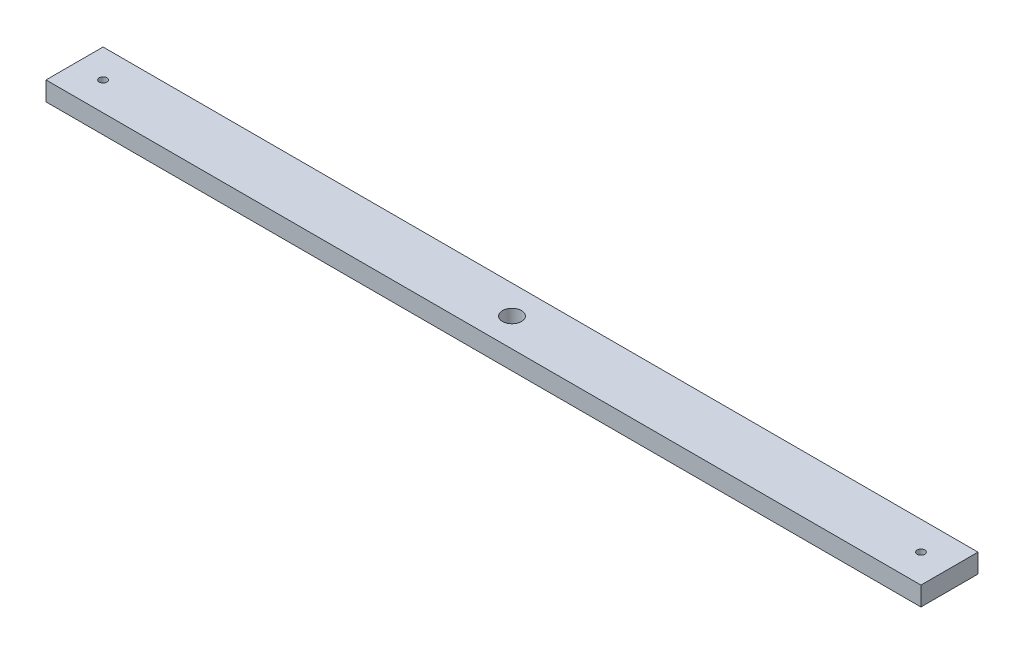
ISO-10303-21;
HEADER;
FILE_DESCRIPTION(('STEP AP214'),'2;1');
FILE_NAME('part.step','',(''),(''),'','','');
FILE_SCHEMA(('AUTOMOTIVE_DESIGN { 1 0 10303 214 1 1 1 1 }'));
ENDSEC;
DATA;
#1=APPLICATION_CONTEXT('core data for automotive mechanical design processes');
#2=APPLICATION_PROTOCOL_DEFINITION('international standard','automotive_design',2000,#1);
#3=PRODUCT_CONTEXT('',#1,'mechanical');
#4=PRODUCT('Part','Part','',(#3));
#5=PRODUCT_RELATED_PRODUCT_CATEGORY('part','',(#4));
#6=PRODUCT_DEFINITION_FORMATION('','',#4);
#7=PRODUCT_DEFINITION_CONTEXT('part definition',#1,'design');
#8=PRODUCT_DEFINITION('design','',#6,#7);
#9=PRODUCT_DEFINITION_SHAPE('','',#8);
#10=(LENGTH_UNIT() NAMED_UNIT(*) SI_UNIT(.MILLI.,.METRE.));
#11=(NAMED_UNIT(*) PLANE_ANGLE_UNIT() SI_UNIT($,.RADIAN.));
#12=(NAMED_UNIT(*) SI_UNIT($,.STERADIAN.) SOLID_ANGLE_UNIT());
#13=UNCERTAINTY_MEASURE_WITH_UNIT(LENGTH_MEASURE(1.E-05),#10,'distance_accuracy_value','');
#14=(GEOMETRIC_REPRESENTATION_CONTEXT(3) GLOBAL_UNCERTAINTY_ASSIGNED_CONTEXT((#13)) GLOBAL_UNIT_ASSIGNED_CONTEXT((#10,
#11,#12)) REPRESENTATION_CONTEXT('',''));
#15=CARTESIAN_POINT('',(0.,0.,0.));
#16=DIRECTION('',(0.,0.,1.));
#17=DIRECTION('',(1.,0.,0.));
#18=AXIS2_PLACEMENT_3D('',#15,#16,#17);
#19=CARTESIAN_POINT('',(292.1,-6.35,-19.05));
#20=DIRECTION('',(0.,0.,1.));
#21=DIRECTION('',(1.,0.,0.));
#22=AXIS2_PLACEMENT_3D('',#19,#20,#21);
#23=PLANE('',#22);
#24=DIRECTION('',(0.,1.,0.));
#25=VECTOR('',#24,1.);
#26=CARTESIAN_POINT('',(-292.1,-6.35,-19.05));
#27=LINE('',#26,#25);
#28=CARTESIAN_POINT('',(-292.1,-6.35,-19.05));
#29=VERTEX_POINT('',#28);
#30=CARTESIAN_POINT('',(-292.1,6.35,-19.05));
#31=VERTEX_POINT('',#30);
#32=EDGE_CURVE('E96',#29,#31,#27,.T.);
#33=ORIENTED_EDGE('',*,*,#32,.T.);
#34=DIRECTION('',(-1.,0.,0.));
#35=VECTOR('',#34,1.);
#36=CARTESIAN_POINT('',(292.1,6.35,-19.05));
#37=LINE('',#36,#35);
#38=CARTESIAN_POINT('',(292.1,6.35,-19.05));
#39=VERTEX_POINT('',#38);
#40=EDGE_CURVE('E11',#39,#31,#37,.T.);
#41=ORIENTED_EDGE('',*,*,#40,.F.);
#42=DIRECTION('',(0.,1.,0.));
#43=VECTOR('',#42,1.);
#44=CARTESIAN_POINT('',(292.1,-6.35,-19.05));
#45=LINE('',#44,#43);
#46=CARTESIAN_POINT('',(292.1,-6.35,-19.05));
#47=VERTEX_POINT('',#46);
#48=EDGE_CURVE('E84',#47,#39,#45,.T.);
#49=ORIENTED_EDGE('',*,*,#48,.F.);
#50=DIRECTION('',(-1.,0.,0.));
#51=VECTOR('',#50,1.);
#52=CARTESIAN_POINT('',(292.1,-6.35,-19.05));
#53=LINE('',#52,#51);
#54=EDGE_CURVE('E92',#47,#29,#53,.T.);
#55=ORIENTED_EDGE('',*,*,#54,.T.);
#56=EDGE_LOOP('',(#33,#41,#49,#55));
#57=FACE_BOUND('',#56,.T.);
#58=ADVANCED_FACE('F33',(#57),#23,.F.);
#59=CARTESIAN_POINT('',(292.1,6.35,19.05));
#60=DIRECTION('',(0.,-1.,0.));
#61=DIRECTION('',(0.,0.,-1.));
#62=AXIS2_PLACEMENT_3D('',#59,#60,#61);
#63=PLANE('',#62);
#64=CARTESIAN_POINT('',(-273.05,6.35,0.));
#65=DIRECTION('',(0.,-1.,0.));
#66=DIRECTION('',(0.,0.,-1.));
#67=AXIS2_PLACEMENT_3D('',#64,#65,#66);
#68=CIRCLE('',#67,2.55270000000002);
#69=CARTESIAN_POINT('',(-273.05,6.35,-2.55270000000002));
#70=VERTEX_POINT('',#69);
#71=EDGE_CURVE('E121',#70,#70,#68,.T.);
#72=ORIENTED_EDGE('',*,*,#71,.T.);
#73=EDGE_LOOP('',(#72));
#74=FACE_BOUND('',#73,.T.);
#75=CARTESIAN_POINT('',(273.05,6.35,0.));
#76=DIRECTION('',(0.,-1.,0.));
#77=DIRECTION('',(0.,0.,-1.));
#78=AXIS2_PLACEMENT_3D('',#75,#76,#77);
#79=CIRCLE('',#78,2.55270000000002);
#80=CARTESIAN_POINT('',(273.05,6.35,-2.55270000000002));
#81=VERTEX_POINT('',#80);
#82=EDGE_CURVE('E113',#81,#81,#79,.T.);
#83=ORIENTED_EDGE('',*,*,#82,.T.);
#84=EDGE_LOOP('',(#83));
#85=FACE_BOUND('',#84,.T.);
#86=CARTESIAN_POINT('',(0.,6.35,0.));
#87=DIRECTION('',(0.,1.,0.));
#88=DIRECTION('',(0.,0.,1.));
#89=AXIS2_PLACEMENT_3D('',#86,#87,#88);
#90=CIRCLE('',#89,6.35);
#91=CARTESIAN_POINT('',(0.,6.35,6.35));
#92=VERTEX_POINT('',#91);
#93=EDGE_CURVE('E110',#92,#92,#90,.T.);
#94=ORIENTED_EDGE('',*,*,#93,.F.);
#95=EDGE_LOOP('',(#94));
#96=FACE_BOUND('',#95,.T.);
#97=DIRECTION('',(0.,0.,1.));
#98=VECTOR('',#97,1.);
#99=CARTESIAN_POINT('',(-292.1,6.35,19.05));
#100=LINE('',#99,#98);
#101=CARTESIAN_POINT('',(-292.1,6.35,19.05));
#102=VERTEX_POINT('',#101);
#103=EDGE_CURVE('E88',#31,#102,#100,.T.);
#104=ORIENTED_EDGE('',*,*,#103,.T.);
#105=DIRECTION('',(-1.,0.,0.));
#106=VECTOR('',#105,1.);
#107=CARTESIAN_POINT('',(292.1,6.35,19.05));
#108=LINE('',#107,#106);
#109=CARTESIAN_POINT('',(292.1,6.35,19.05));
#110=VERTEX_POINT('',#109);
#111=EDGE_CURVE('E41',#110,#102,#108,.T.);
#112=ORIENTED_EDGE('',*,*,#111,.F.);
#113=DIRECTION('',(0.,0.,1.));
#114=VECTOR('',#113,1.);
#115=CARTESIAN_POINT('',(292.1,6.35,19.05));
#116=LINE('',#115,#114);
#117=EDGE_CURVE('E79',#39,#110,#116,.T.);
#118=ORIENTED_EDGE('',*,*,#117,.F.);
#119=ORIENTED_EDGE('',*,*,#40,.T.);
#120=EDGE_LOOP('',(#104,#112,#118,#119));
#121=FACE_BOUND('',#120,.T.);
#122=ADVANCED_FACE('F87',(#74,#85,#96,#121),#63,.F.);
#123=CARTESIAN_POINT('',(292.1,-6.35,19.05));
#124=DIRECTION('',(0.,0.,-1.));
#125=DIRECTION('',(-1.,0.,0.));
#126=AXIS2_PLACEMENT_3D('',#123,#124,#125);
#127=PLANE('',#126);
#128=DIRECTION('',(0.,-1.,0.));
#129=VECTOR('',#128,1.);
#130=CARTESIAN_POINT('',(-292.1,-6.35,19.05));
#131=LINE('',#130,#129);
#132=CARTESIAN_POINT('',(-292.1,-6.35,19.05));
#133=VERTEX_POINT('',#132);
#134=EDGE_CURVE('E66',#102,#133,#131,.T.);
#135=ORIENTED_EDGE('',*,*,#134,.T.);
#136=DIRECTION('',(-1.,0.,0.));
#137=VECTOR('',#136,1.);
#138=CARTESIAN_POINT('',(292.1,-6.35,19.05));
#139=LINE('',#138,#137);
#140=CARTESIAN_POINT('',(292.1,-6.35,19.05));
#141=VERTEX_POINT('',#140);
#142=EDGE_CURVE('E89',#141,#133,#139,.T.);
#143=ORIENTED_EDGE('',*,*,#142,.F.);
#144=DIRECTION('',(0.,-1.,0.));
#145=VECTOR('',#144,1.);
#146=CARTESIAN_POINT('',(292.1,-6.35,19.05));
#147=LINE('',#146,#145);
#148=EDGE_CURVE('E82',#110,#141,#147,.T.);
#149=ORIENTED_EDGE('',*,*,#148,.F.);
#150=ORIENTED_EDGE('',*,*,#111,.T.);
#151=EDGE_LOOP('',(#135,#143,#149,#150));
#152=FACE_BOUND('',#151,.T.);
#153=ADVANCED_FACE('F90',(#152),#127,.F.);
#154=CARTESIAN_POINT('',(292.1,-6.35,19.05));
#155=DIRECTION('',(0.,1.,0.));
#156=DIRECTION('',(0.,0.,1.));
#157=AXIS2_PLACEMENT_3D('',#154,#155,#156);
#158=PLANE('',#157);
#159=CARTESIAN_POINT('',(-273.05,-6.35,0.));
#160=DIRECTION('',(0.,-1.,0.));
#161=DIRECTION('',(0.,0.,-1.));
#162=AXIS2_PLACEMENT_3D('',#159,#160,#161);
#163=CIRCLE('',#162,2.55269999999996);
#164=CARTESIAN_POINT('',(-273.05,-6.35,-2.55269999999996));
#165=VERTEX_POINT('',#164);
#166=EDGE_CURVE('E124',#165,#165,#163,.T.);
#167=ORIENTED_EDGE('',*,*,#166,.F.);
#168=EDGE_LOOP('',(#167));
#169=FACE_BOUND('',#168,.T.);
#170=CARTESIAN_POINT('',(273.05,-6.35,0.));
#171=DIRECTION('',(0.,-1.,0.));
#172=DIRECTION('',(0.,0.,-1.));
#173=AXIS2_PLACEMENT_3D('',#170,#171,#172);
#174=CIRCLE('',#173,2.55269999999996);
#175=CARTESIAN_POINT('',(273.05,-6.35,-2.55269999999996));
#176=VERTEX_POINT('',#175);
#177=EDGE_CURVE('E118',#176,#176,#174,.T.);
#178=ORIENTED_EDGE('',*,*,#177,.F.);
#179=EDGE_LOOP('',(#178));
#180=FACE_BOUND('',#179,.T.);
#181=CARTESIAN_POINT('',(0.,-6.35,0.));
#182=DIRECTION('',(0.,1.,0.));
#183=DIRECTION('',(0.,0.,1.));
#184=AXIS2_PLACEMENT_3D('',#181,#182,#183);
#185=CIRCLE('',#184,6.35);
#186=CARTESIAN_POINT('',(0.,-6.35,6.35));
#187=VERTEX_POINT('',#186);
#188=EDGE_CURVE('E99',#187,#187,#185,.T.);
#189=ORIENTED_EDGE('',*,*,#188,.T.);
#190=EDGE_LOOP('',(#189));
#191=FACE_BOUND('',#190,.T.);
#192=DIRECTION('',(0.,0.,-1.));
#193=VECTOR('',#192,1.);
#194=CARTESIAN_POINT('',(-292.1,-6.35,19.05));
#195=LINE('',#194,#193);
#196=EDGE_CURVE('E72',#133,#29,#195,.T.);
#197=ORIENTED_EDGE('',*,*,#196,.T.);
#198=ORIENTED_EDGE('',*,*,#54,.F.);
#199=DIRECTION('',(0.,0.,-1.));
#200=VECTOR('',#199,1.);
#201=CARTESIAN_POINT('',(292.1,-6.35,19.05));
#202=LINE('',#201,#200);
#203=EDGE_CURVE('E49',#141,#47,#202,.T.);
#204=ORIENTED_EDGE('',*,*,#203,.F.);
#205=ORIENTED_EDGE('',*,*,#142,.T.);
#206=EDGE_LOOP('',(#197,#198,#204,#205));
#207=FACE_BOUND('',#206,.T.);
#208=ADVANCED_FACE('F104',(#169,#180,#191,#207),#158,.F.);
#209=CARTESIAN_POINT('',(292.1,0.,0.));
#210=DIRECTION('',(-1.,0.,0.));
#211=DIRECTION('',(0.,0.,1.));
#212=AXIS2_PLACEMENT_3D('',#209,#210,#211);
#213=PLANE('',#212);
#214=ORIENTED_EDGE('',*,*,#48,.T.);
#215=ORIENTED_EDGE('',*,*,#117,.T.);
#216=ORIENTED_EDGE('',*,*,#148,.T.);
#217=ORIENTED_EDGE('',*,*,#203,.T.);
#218=EDGE_LOOP('',(#214,#215,#216,#217));
#219=FACE_BOUND('',#218,.T.);
#220=ADVANCED_FACE('F80',(#219),#213,.F.);
#221=CARTESIAN_POINT('',(-292.1,0.,0.));
#222=DIRECTION('',(-1.,0.,0.));
#223=DIRECTION('',(0.,0.,1.));
#224=AXIS2_PLACEMENT_3D('',#221,#222,#223);
#225=PLANE('',#224);
#226=ORIENTED_EDGE('',*,*,#32,.F.);
#227=ORIENTED_EDGE('',*,*,#196,.F.);
#228=ORIENTED_EDGE('',*,*,#134,.F.);
#229=ORIENTED_EDGE('',*,*,#103,.F.);
#230=EDGE_LOOP('',(#226,#227,#228,#229));
#231=FACE_BOUND('',#230,.T.);
#232=ADVANCED_FACE('F107',(#231),#225,.T.);
#233=CARTESIAN_POINT('',(0.,-6.35,0.));
#234=DIRECTION('',(0.,1.,0.));
#235=DIRECTION('',(0.,0.,1.));
#236=AXIS2_PLACEMENT_3D('',#233,#234,#235);
#237=CYLINDRICAL_SURFACE('',#236,6.35);
#238=ORIENTED_EDGE('',*,*,#188,.F.);
#239=EDGE_LOOP('',(#238));
#240=FACE_BOUND('',#239,.T.);
#241=ORIENTED_EDGE('',*,*,#93,.T.);
#242=EDGE_LOOP('',(#241));
#243=FACE_BOUND('',#242,.T.);
#244=ADVANCED_FACE('F137',(#240,#243),#237,.F.);
#245=CARTESIAN_POINT('',(273.05,-6.35,0.));
#246=DIRECTION('',(0.,-1.,0.));
#247=DIRECTION('',(0.,0.,-1.));
#248=AXIS2_PLACEMENT_3D('',#245,#246,#247);
#249=CYLINDRICAL_SURFACE('',#248,2.55269999999999);
#250=ORIENTED_EDGE('',*,*,#82,.F.);
#251=EDGE_LOOP('',(#250));
#252=FACE_BOUND('',#251,.T.);
#253=ORIENTED_EDGE('',*,*,#177,.T.);
#254=EDGE_LOOP('',(#253));
#255=FACE_BOUND('',#254,.T.);
#256=ADVANCED_FACE('F140',(#252,#255),#249,.F.);
#257=CARTESIAN_POINT('',(-273.05,-6.35,0.));
#258=DIRECTION('',(0.,-1.,0.));
#259=DIRECTION('',(0.,0.,-1.));
#260=AXIS2_PLACEMENT_3D('',#257,#258,#259);
#261=CYLINDRICAL_SURFACE('',#260,2.55269999999999);
#262=ORIENTED_EDGE('',*,*,#71,.F.);
#263=EDGE_LOOP('',(#262));
#264=FACE_BOUND('',#263,.T.);
#265=ORIENTED_EDGE('',*,*,#166,.T.);
#266=EDGE_LOOP('',(#265));
#267=FACE_BOUND('',#266,.T.);
#268=ADVANCED_FACE('F128',(#264,#267),#261,.F.);
#269=CLOSED_SHELL('',(#58,#122,#153,#208,#220,#232,#244,#256,#268));
#270=MANIFOLD_SOLID_BREP('B2',#269);
#271=ADVANCED_BREP_SHAPE_REPRESENTATION('',(#18,#270),#14);
#272=SHAPE_DEFINITION_REPRESENTATION(#9,#271);
ENDSEC;
END-ISO-10303-21;
